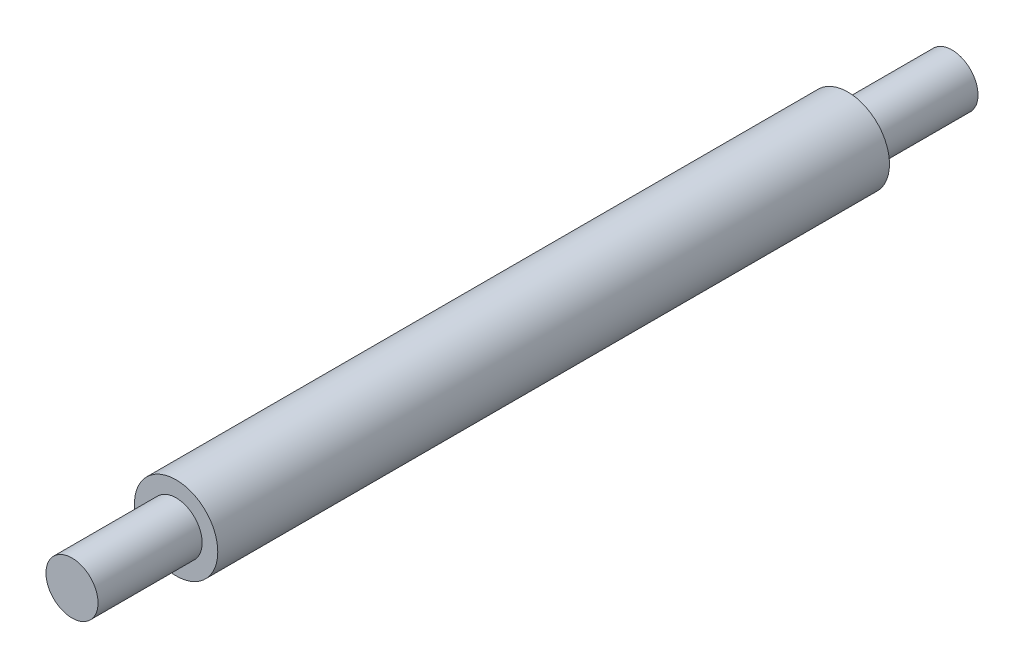
ISO-10303-21;
HEADER;
FILE_DESCRIPTION(('STEP AP214'),'2;1');
FILE_NAME('part.step','',(''),(''),'','','');
FILE_SCHEMA(('AUTOMOTIVE_DESIGN { 1 0 10303 214 1 1 1 1 }'));
ENDSEC;
DATA;
#1=APPLICATION_CONTEXT('core data for automotive mechanical design processes');
#2=APPLICATION_PROTOCOL_DEFINITION('international standard','automotive_design',2000,#1);
#3=PRODUCT_CONTEXT('',#1,'mechanical');
#4=PRODUCT('Part','Part','',(#3));
#5=PRODUCT_RELATED_PRODUCT_CATEGORY('part','',(#4));
#6=PRODUCT_DEFINITION_FORMATION('','',#4);
#7=PRODUCT_DEFINITION_CONTEXT('part definition',#1,'design');
#8=PRODUCT_DEFINITION('design','',#6,#7);
#9=PRODUCT_DEFINITION_SHAPE('','',#8);
#10=(LENGTH_UNIT() NAMED_UNIT(*) SI_UNIT(.MILLI.,.METRE.));
#11=(NAMED_UNIT(*) PLANE_ANGLE_UNIT() SI_UNIT($,.RADIAN.));
#12=(NAMED_UNIT(*) SI_UNIT($,.STERADIAN.) SOLID_ANGLE_UNIT());
#13=UNCERTAINTY_MEASURE_WITH_UNIT(LENGTH_MEASURE(1.E-05),#10,'distance_accuracy_value','');
#14=(GEOMETRIC_REPRESENTATION_CONTEXT(3) GLOBAL_UNCERTAINTY_ASSIGNED_CONTEXT((#13)) GLOBAL_UNIT_ASSIGNED_CONTEXT((#10,
#11,#12)) REPRESENTATION_CONTEXT('',''));
#15=CARTESIAN_POINT('',(0.,0.,0.));
#16=DIRECTION('',(0.,0.,1.));
#17=DIRECTION('',(1.,0.,0.));
#18=AXIS2_PLACEMENT_3D('',#15,#16,#17);
#19=CARTESIAN_POINT('',(0.,0.,819.15));
#20=DIRECTION('',(0.,0.,-1.));
#21=DIRECTION('',(-1.,0.,0.));
#22=AXIS2_PLACEMENT_3D('',#19,#20,#21);
#23=CYLINDRICAL_SURFACE('',#22,101.6);
#24=CARTESIAN_POINT('',(0.,0.,819.15));
#25=DIRECTION('',(0.,0.,1.));
#26=DIRECTION('',(1.,0.,0.));
#27=AXIS2_PLACEMENT_3D('',#24,#25,#26);
#28=CIRCLE('',#27,101.6);
#29=CARTESIAN_POINT('',(101.6,0.,819.15));
#30=VERTEX_POINT('',#29);
#31=EDGE_CURVE('E44',#30,#30,#28,.T.);
#32=ORIENTED_EDGE('',*,*,#31,.F.);
#33=EDGE_LOOP('',(#32));
#34=FACE_BOUND('',#33,.T.);
#35=CARTESIAN_POINT('',(0.,0.,-819.15));
#36=DIRECTION('',(0.,0.,1.));
#37=DIRECTION('',(1.,0.,0.));
#38=AXIS2_PLACEMENT_3D('',#35,#36,#37);
#39=CIRCLE('',#38,101.6);
#40=CARTESIAN_POINT('',(101.6,0.,-819.15));
#41=VERTEX_POINT('',#40);
#42=EDGE_CURVE('E40',#41,#41,#39,.T.);
#43=ORIENTED_EDGE('',*,*,#42,.T.);
#44=EDGE_LOOP('',(#43));
#45=FACE_BOUND('',#44,.T.);
#46=ADVANCED_FACE('F37',(#34,#45),#23,.T.);
#47=CARTESIAN_POINT('',(0.,0.,819.15));
#48=DIRECTION('',(0.,0.,1.));
#49=DIRECTION('',(1.,0.,0.));
#50=AXIS2_PLACEMENT_3D('',#47,#48,#49);
#51=PLANE('',#50);
#52=CARTESIAN_POINT('',(0.,0.,819.15));
#53=DIRECTION('',(0.,0.,1.));
#54=DIRECTION('',(1.,0.,0.));
#55=AXIS2_PLACEMENT_3D('',#52,#53,#54);
#56=CIRCLE('',#55,63.5);
#57=CARTESIAN_POINT('',(63.5,0.,819.15));
#58=VERTEX_POINT('',#57);
#59=EDGE_CURVE('E10',#58,#58,#56,.T.);
#60=ORIENTED_EDGE('',*,*,#59,.F.);
#61=EDGE_LOOP('',(#60));
#62=FACE_BOUND('',#61,.T.);
#63=ORIENTED_EDGE('',*,*,#31,.T.);
#64=EDGE_LOOP('',(#63));
#65=FACE_BOUND('',#64,.T.);
#66=ADVANCED_FACE('F72',(#62,#65),#51,.T.);
#67=CARTESIAN_POINT('',(0.,0.,-819.15));
#68=DIRECTION('',(0.,0.,1.));
#69=DIRECTION('',(1.,0.,0.));
#70=AXIS2_PLACEMENT_3D('',#67,#68,#69);
#71=PLANE('',#70);
#72=CARTESIAN_POINT('',(0.,0.,-819.15));
#73=DIRECTION('',(0.,0.,1.));
#74=DIRECTION('',(1.,0.,0.));
#75=AXIS2_PLACEMENT_3D('',#72,#73,#74);
#76=CIRCLE('',#75,63.5);
#77=CARTESIAN_POINT('',(63.5,0.,-819.15));
#78=VERTEX_POINT('',#77);
#79=EDGE_CURVE('E54',#78,#78,#76,.T.);
#80=ORIENTED_EDGE('',*,*,#79,.T.);
#81=EDGE_LOOP('',(#80));
#82=FACE_BOUND('',#81,.T.);
#83=ORIENTED_EDGE('',*,*,#42,.F.);
#84=EDGE_LOOP('',(#83));
#85=FACE_BOUND('',#84,.T.);
#86=ADVANCED_FACE('F77',(#82,#85),#71,.F.);
#87=CARTESIAN_POINT('',(0.,0.,1073.15));
#88=DIRECTION('',(0.,0.,-1.));
#89=DIRECTION('',(-1.,0.,0.));
#90=AXIS2_PLACEMENT_3D('',#87,#88,#89);
#91=CYLINDRICAL_SURFACE('',#90,63.5);
#92=CARTESIAN_POINT('',(0.,0.,1073.15));
#93=DIRECTION('',(0.,0.,1.));
#94=DIRECTION('',(1.,0.,0.));
#95=AXIS2_PLACEMENT_3D('',#92,#93,#94);
#96=CIRCLE('',#95,63.5);
#97=CARTESIAN_POINT('',(63.5,0.,1073.15));
#98=VERTEX_POINT('',#97);
#99=EDGE_CURVE('E50',#98,#98,#96,.T.);
#100=ORIENTED_EDGE('',*,*,#99,.F.);
#101=EDGE_LOOP('',(#100));
#102=FACE_BOUND('',#101,.T.);
#103=ORIENTED_EDGE('',*,*,#59,.T.);
#104=EDGE_LOOP('',(#103));
#105=FACE_BOUND('',#104,.T.);
#106=ADVANCED_FACE('F86',(#102,#105),#91,.T.);
#107=CARTESIAN_POINT('',(0.,0.,1073.15));
#108=DIRECTION('',(0.,0.,1.));
#109=DIRECTION('',(1.,0.,0.));
#110=AXIS2_PLACEMENT_3D('',#107,#108,#109);
#111=PLANE('',#110);
#112=ORIENTED_EDGE('',*,*,#99,.T.);
#113=EDGE_LOOP('',(#112));
#114=FACE_BOUND('',#113,.T.);
#115=ADVANCED_FACE('F69',(#114),#111,.T.);
#116=CARTESIAN_POINT('',(0.,0.,-1073.15));
#117=DIRECTION('',(0.,0.,1.));
#118=DIRECTION('',(1.,0.,0.));
#119=AXIS2_PLACEMENT_3D('',#116,#117,#118);
#120=CYLINDRICAL_SURFACE('',#119,63.5);
#121=CARTESIAN_POINT('',(0.,0.,-1073.15));
#122=DIRECTION('',(0.,0.,1.));
#123=DIRECTION('',(1.,0.,0.));
#124=AXIS2_PLACEMENT_3D('',#121,#122,#123);
#125=CIRCLE('',#124,63.5);
#126=CARTESIAN_POINT('',(63.5,0.,-1073.15));
#127=VERTEX_POINT('',#126);
#128=EDGE_CURVE('E53',#127,#127,#125,.T.);
#129=ORIENTED_EDGE('',*,*,#128,.T.);
#130=EDGE_LOOP('',(#129));
#131=FACE_BOUND('',#130,.T.);
#132=ORIENTED_EDGE('',*,*,#79,.F.);
#133=EDGE_LOOP('',(#132));
#134=FACE_BOUND('',#133,.T.);
#135=ADVANCED_FACE('F60',(#131,#134),#120,.T.);
#136=CARTESIAN_POINT('',(0.,0.,-1073.15));
#137=DIRECTION('',(0.,0.,-1.));
#138=DIRECTION('',(1.,0.,0.));
#139=AXIS2_PLACEMENT_3D('',#136,#137,#138);
#140=PLANE('',#139);
#141=ORIENTED_EDGE('',*,*,#128,.F.);
#142=EDGE_LOOP('',(#141));
#143=FACE_BOUND('',#142,.T.);
#144=ADVANCED_FACE('F63',(#143),#140,.T.);
#145=CLOSED_SHELL('',(#46,#66,#86,#106,#115,#135,#144));
#146=MANIFOLD_SOLID_BREP('B2',#145);
#147=ADVANCED_BREP_SHAPE_REPRESENTATION('',(#18,#146),#14);
#148=SHAPE_DEFINITION_REPRESENTATION(#9,#147);
ENDSEC;
END-ISO-10303-21;
